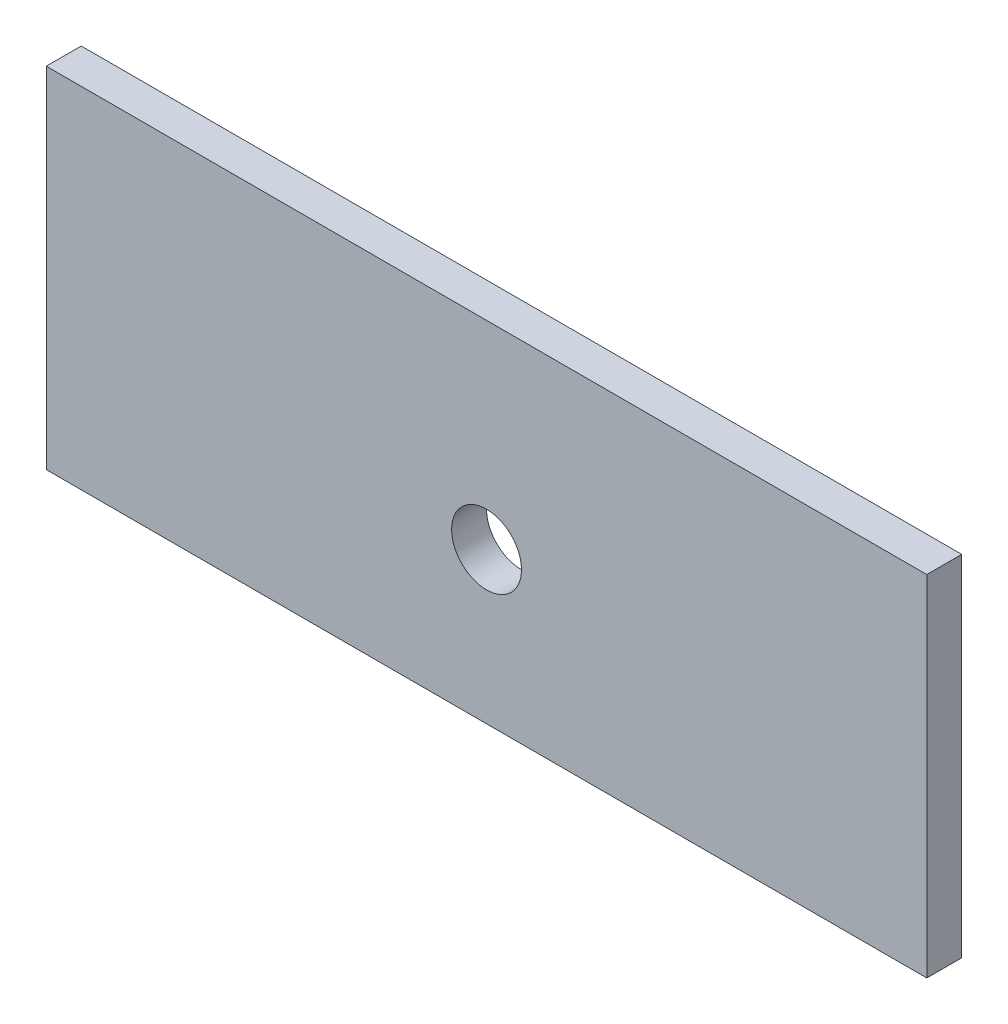
ISO-10303-21;
HEADER;
FILE_DESCRIPTION(('STEP AP214'),'2;1');
FILE_NAME('part.step','',(''),(''),'','','');
FILE_SCHEMA(('AUTOMOTIVE_DESIGN { 1 0 10303 214 1 1 1 1 }'));
ENDSEC;
DATA;
#1=APPLICATION_CONTEXT('core data for automotive mechanical design processes');
#2=APPLICATION_PROTOCOL_DEFINITION('international standard','automotive_design',2000,#1);
#3=PRODUCT_CONTEXT('',#1,'mechanical');
#4=PRODUCT('Part','Part','',(#3));
#5=PRODUCT_RELATED_PRODUCT_CATEGORY('part','',(#4));
#6=PRODUCT_DEFINITION_FORMATION('','',#4);
#7=PRODUCT_DEFINITION_CONTEXT('part definition',#1,'design');
#8=PRODUCT_DEFINITION('design','',#6,#7);
#9=PRODUCT_DEFINITION_SHAPE('','',#8);
#10=(LENGTH_UNIT() NAMED_UNIT(*) SI_UNIT(.MILLI.,.METRE.));
#11=(NAMED_UNIT(*) PLANE_ANGLE_UNIT() SI_UNIT($,.RADIAN.));
#12=(NAMED_UNIT(*) SI_UNIT($,.STERADIAN.) SOLID_ANGLE_UNIT());
#13=UNCERTAINTY_MEASURE_WITH_UNIT(LENGTH_MEASURE(1.E-05),#10,'distance_accuracy_value','');
#14=(GEOMETRIC_REPRESENTATION_CONTEXT(3) GLOBAL_UNCERTAINTY_ASSIGNED_CONTEXT((#13)) GLOBAL_UNIT_ASSIGNED_CONTEXT((#10,
#11,#12)) REPRESENTATION_CONTEXT('',''));
#15=CARTESIAN_POINT('',(0.,0.,0.));
#16=DIRECTION('',(0.,0.,1.));
#17=DIRECTION('',(1.,0.,0.));
#18=AXIS2_PLACEMENT_3D('',#15,#16,#17);
#19=CARTESIAN_POINT('',(67.0777355741105,-9.75800805165922,3.175));
#20=DIRECTION('',(0.,-1.,0.));
#21=DIRECTION('',(1.,0.,0.));
#22=AXIS2_PLACEMENT_3D('',#19,#20,#21);
#23=PLANE('',#22);
#24=DIRECTION('',(-1.,0.,0.));
#25=VECTOR('',#24,1.);
#26=CARTESIAN_POINT('',(67.0777355741105,-9.75800805165922,0.));
#27=LINE('',#26,#25);
#28=CARTESIAN_POINT('',(67.0777355741105,-9.75800805165922,0.));
#29=VERTEX_POINT('',#28);
#30=CARTESIAN_POINT('',(-12.9322644258895,-9.75800805165924,0.));
#31=VERTEX_POINT('',#30);
#32=EDGE_CURVE('E109',#29,#31,#27,.T.);
#33=ORIENTED_EDGE('',*,*,#32,.F.);
#34=DIRECTION('',(0.,0.,-1.));
#35=VECTOR('',#34,1.);
#36=CARTESIAN_POINT('',(67.0777355741105,-9.75800805165922,3.175));
#37=LINE('',#36,#35);
#38=CARTESIAN_POINT('',(67.0777355741105,-9.75800805165922,3.175));
#39=VERTEX_POINT('',#38);
#40=EDGE_CURVE('E11',#39,#29,#37,.T.);
#41=ORIENTED_EDGE('',*,*,#40,.F.);
#42=DIRECTION('',(-1.,0.,0.));
#43=VECTOR('',#42,1.);
#44=CARTESIAN_POINT('',(67.0777355741105,-9.75800805165922,3.175));
#45=LINE('',#44,#43);
#46=CARTESIAN_POINT('',(-12.9322644258895,-9.75800805165924,3.175));
#47=VERTEX_POINT('',#46);
#48=EDGE_CURVE('E100',#39,#47,#45,.T.);
#49=ORIENTED_EDGE('',*,*,#48,.T.);
#50=DIRECTION('',(0.,0.,-1.));
#51=VECTOR('',#50,1.);
#52=CARTESIAN_POINT('',(-12.9322644258895,-9.75800805165924,3.175));
#53=LINE('',#52,#51);
#54=EDGE_CURVE('E41',#47,#31,#53,.T.);
#55=ORIENTED_EDGE('',*,*,#54,.T.);
#56=EDGE_LOOP('',(#33,#41,#49,#55));
#57=FACE_BOUND('',#56,.T.);
#58=ADVANCED_FACE('F38',(#57),#23,.T.);
#59=CARTESIAN_POINT('',(67.0777355741105,21.9919919483408,3.175));
#60=DIRECTION('',(1.,0.,0.));
#61=DIRECTION('',(0.,0.,-1.));
#62=AXIS2_PLACEMENT_3D('',#59,#60,#61);
#63=PLANE('',#62);
#64=DIRECTION('',(0.,-1.,0.));
#65=VECTOR('',#64,1.);
#66=CARTESIAN_POINT('',(67.0777355741105,21.9919919483408,0.));
#67=LINE('',#66,#65);
#68=CARTESIAN_POINT('',(67.0777355741105,21.9919919483408,0.));
#69=VERTEX_POINT('',#68);
#70=EDGE_CURVE('E103',#69,#29,#67,.T.);
#71=ORIENTED_EDGE('',*,*,#70,.F.);
#72=DIRECTION('',(0.,0.,-1.));
#73=VECTOR('',#72,1.);
#74=CARTESIAN_POINT('',(67.0777355741105,21.9919919483408,3.175));
#75=LINE('',#74,#73);
#76=CARTESIAN_POINT('',(67.0777355741105,21.9919919483408,3.175));
#77=VERTEX_POINT('',#76);
#78=EDGE_CURVE('E48',#77,#69,#75,.T.);
#79=ORIENTED_EDGE('',*,*,#78,.F.);
#80=DIRECTION('',(0.,-1.,0.));
#81=VECTOR('',#80,1.);
#82=CARTESIAN_POINT('',(67.0777355741105,21.9919919483408,3.175));
#83=LINE('',#82,#81);
#84=EDGE_CURVE('E95',#77,#39,#83,.T.);
#85=ORIENTED_EDGE('',*,*,#84,.T.);
#86=ORIENTED_EDGE('',*,*,#40,.T.);
#87=EDGE_LOOP('',(#71,#79,#85,#86));
#88=FACE_BOUND('',#87,.T.);
#89=ADVANCED_FACE('F126',(#88),#63,.T.);
#90=CARTESIAN_POINT('',(-12.9322644258895,21.9919919483408,3.175));
#91=DIRECTION('',(0.,1.,0.));
#92=DIRECTION('',(0.,0.,1.));
#93=AXIS2_PLACEMENT_3D('',#90,#91,#92);
#94=PLANE('',#93);
#95=DIRECTION('',(1.,0.,0.));
#96=VECTOR('',#95,1.);
#97=CARTESIAN_POINT('',(-12.9322644258895,21.9919919483408,0.));
#98=LINE('',#97,#96);
#99=CARTESIAN_POINT('',(-12.9322644258895,21.9919919483408,0.));
#100=VERTEX_POINT('',#99);
#101=EDGE_CURVE('E89',#100,#69,#98,.T.);
#102=ORIENTED_EDGE('',*,*,#101,.F.);
#103=DIRECTION('',(0.,0.,-1.));
#104=VECTOR('',#103,1.);
#105=CARTESIAN_POINT('',(-12.9322644258895,21.9919919483408,3.175));
#106=LINE('',#105,#104);
#107=CARTESIAN_POINT('',(-12.9322644258895,21.9919919483408,3.175));
#108=VERTEX_POINT('',#107);
#109=EDGE_CURVE('E84',#108,#100,#106,.T.);
#110=ORIENTED_EDGE('',*,*,#109,.F.);
#111=DIRECTION('',(1.,0.,0.));
#112=VECTOR('',#111,1.);
#113=CARTESIAN_POINT('',(-12.9322644258895,21.9919919483408,3.175));
#114=LINE('',#113,#112);
#115=EDGE_CURVE('E87',#108,#77,#114,.T.);
#116=ORIENTED_EDGE('',*,*,#115,.T.);
#117=ORIENTED_EDGE('',*,*,#78,.T.);
#118=EDGE_LOOP('',(#102,#110,#116,#117));
#119=FACE_BOUND('',#118,.T.);
#120=ADVANCED_FACE('F86',(#119),#94,.T.);
#121=CARTESIAN_POINT('',(-12.9322644258895,-9.75800805165924,3.175));
#122=DIRECTION('',(-1.,0.,0.));
#123=DIRECTION('',(0.,0.,1.));
#124=AXIS2_PLACEMENT_3D('',#121,#122,#123);
#125=PLANE('',#124);
#126=DIRECTION('',(0.,1.,0.));
#127=VECTOR('',#126,1.);
#128=CARTESIAN_POINT('',(-12.9322644258895,-9.75800805165924,0.));
#129=LINE('',#128,#127);
#130=EDGE_CURVE('E113',#31,#100,#129,.T.);
#131=ORIENTED_EDGE('',*,*,#130,.F.);
#132=ORIENTED_EDGE('',*,*,#54,.F.);
#133=DIRECTION('',(0.,1.,0.));
#134=VECTOR('',#133,1.);
#135=CARTESIAN_POINT('',(-12.9322644258895,-9.75800805165924,3.175));
#136=LINE('',#135,#134);
#137=EDGE_CURVE('E94',#47,#108,#136,.T.);
#138=ORIENTED_EDGE('',*,*,#137,.T.);
#139=ORIENTED_EDGE('',*,*,#109,.T.);
#140=EDGE_LOOP('',(#131,#132,#138,#139));
#141=FACE_BOUND('',#140,.T.);
#142=ADVANCED_FACE('F98',(#141),#125,.T.);
#143=CARTESIAN_POINT('',(0.,0.,3.175));
#144=DIRECTION('',(0.,0.,-1.));
#145=DIRECTION('',(-1.,0.,0.));
#146=AXIS2_PLACEMENT_3D('',#143,#144,#145);
#147=PLANE('',#146);
#148=CARTESIAN_POINT('',(27.0727355741105,3.95799194834078,3.175));
#149=DIRECTION('',(0.,0.,-1.));
#150=DIRECTION('',(-1.,0.,0.));
#151=AXIS2_PLACEMENT_3D('',#148,#149,#150);
#152=CIRCLE('',#151,3.175);
#153=CARTESIAN_POINT('',(23.8977355741105,3.95799194834078,3.175));
#154=VERTEX_POINT('',#153);
#155=EDGE_CURVE('E114',#154,#154,#152,.T.);
#156=ORIENTED_EDGE('',*,*,#155,.T.);
#157=EDGE_LOOP('',(#156));
#158=FACE_BOUND('',#157,.T.);
#159=ORIENTED_EDGE('',*,*,#48,.F.);
#160=ORIENTED_EDGE('',*,*,#84,.F.);
#161=ORIENTED_EDGE('',*,*,#115,.F.);
#162=ORIENTED_EDGE('',*,*,#137,.F.);
#163=EDGE_LOOP('',(#159,#160,#161,#162));
#164=FACE_BOUND('',#163,.T.);
#165=ADVANCED_FACE('F93',(#158,#164),#147,.F.);
#166=CARTESIAN_POINT('',(0.,0.,0.));
#167=DIRECTION('',(0.,0.,-1.));
#168=DIRECTION('',(-1.,0.,0.));
#169=AXIS2_PLACEMENT_3D('',#166,#167,#168);
#170=PLANE('',#169);
#171=CARTESIAN_POINT('',(27.0727355741105,3.95799194834078,0.));
#172=DIRECTION('',(0.,0.,-1.));
#173=DIRECTION('',(-1.,0.,0.));
#174=AXIS2_PLACEMENT_3D('',#171,#172,#173);
#175=CIRCLE('',#174,3.175);
#176=CARTESIAN_POINT('',(23.8977355741105,3.95799194834078,0.));
#177=VERTEX_POINT('',#176);
#178=EDGE_CURVE('E155',#177,#177,#175,.T.);
#179=ORIENTED_EDGE('',*,*,#178,.F.);
#180=EDGE_LOOP('',(#179));
#181=FACE_BOUND('',#180,.T.);
#182=ORIENTED_EDGE('',*,*,#32,.T.);
#183=ORIENTED_EDGE('',*,*,#130,.T.);
#184=ORIENTED_EDGE('',*,*,#101,.T.);
#185=ORIENTED_EDGE('',*,*,#70,.T.);
#186=EDGE_LOOP('',(#182,#183,#184,#185));
#187=FACE_BOUND('',#186,.T.);
#188=ADVANCED_FACE('F125',(#181,#187),#170,.T.);
#189=CARTESIAN_POINT('',(27.0727355741105,3.95799194834078,12.7));
#190=DIRECTION('',(0.,0.,-1.));
#191=DIRECTION('',(-1.,0.,0.));
#192=AXIS2_PLACEMENT_3D('',#189,#190,#191);
#193=CYLINDRICAL_SURFACE('',#192,3.175);
#194=ORIENTED_EDGE('',*,*,#178,.T.);
#195=EDGE_LOOP('',(#194));
#196=FACE_BOUND('',#195,.T.);
#197=ORIENTED_EDGE('',*,*,#155,.F.);
#198=EDGE_LOOP('',(#197));
#199=FACE_BOUND('',#198,.T.);
#200=ADVANCED_FACE('F144',(#196,#199),#193,.F.);
#201=CLOSED_SHELL('',(#58,#89,#120,#142,#165,#188,#200));
#202=MANIFOLD_SOLID_BREP('B2',#201);
#203=ADVANCED_BREP_SHAPE_REPRESENTATION('',(#18,#202),#14);
#204=SHAPE_DEFINITION_REPRESENTATION(#9,#203);
ENDSEC;
END-ISO-10303-21;
